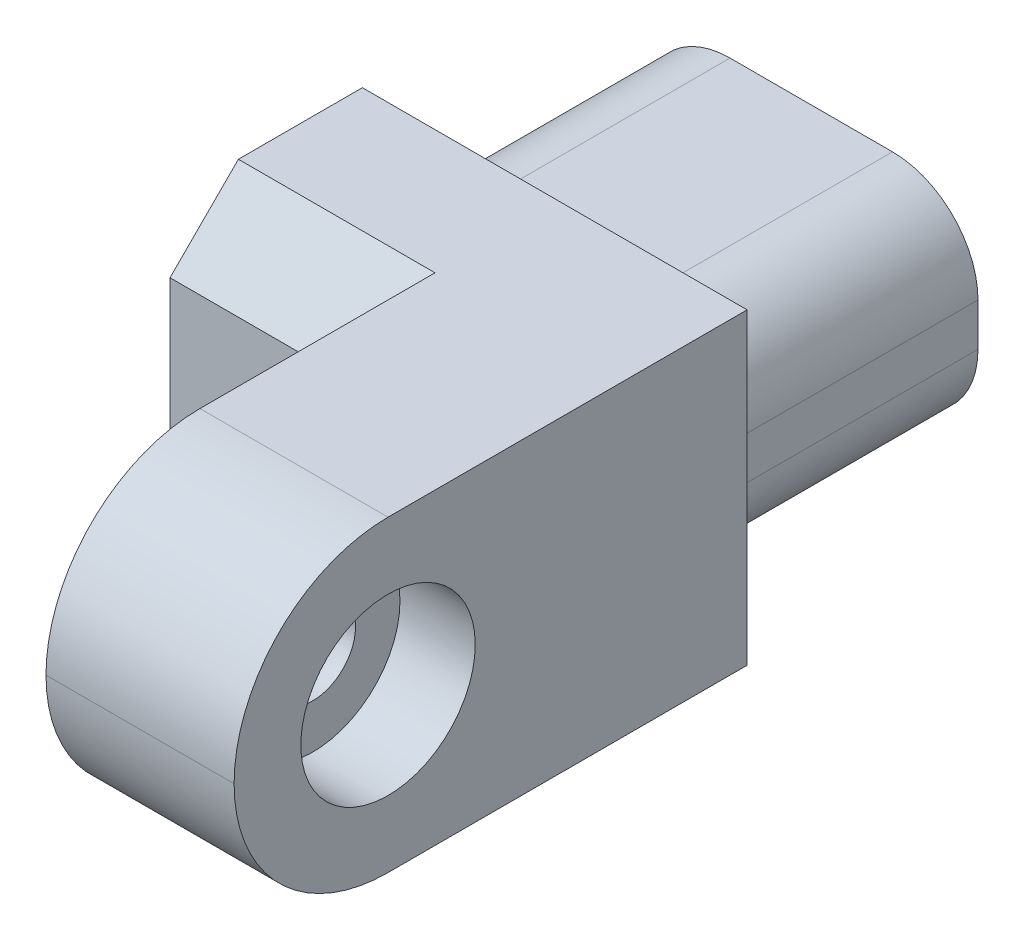
ISO-10303-21;
HEADER;
FILE_DESCRIPTION(('STEP AP214'),'2;1');
FILE_NAME('part.step','',(''),(''),'','','');
FILE_SCHEMA(('AUTOMOTIVE_DESIGN { 1 0 10303 214 1 1 1 1 }'));
ENDSEC;
DATA;
#1=APPLICATION_CONTEXT('core data for automotive mechanical design processes');
#2=APPLICATION_PROTOCOL_DEFINITION('international standard','automotive_design',2000,#1);
#3=PRODUCT_CONTEXT('',#1,'mechanical');
#4=PRODUCT('Part','Part','',(#3));
#5=PRODUCT_RELATED_PRODUCT_CATEGORY('part','',(#4));
#6=PRODUCT_DEFINITION_FORMATION('','',#4);
#7=PRODUCT_DEFINITION_CONTEXT('part definition',#1,'design');
#8=PRODUCT_DEFINITION('design','',#6,#7);
#9=PRODUCT_DEFINITION_SHAPE('','',#8);
#10=(LENGTH_UNIT() NAMED_UNIT(*) SI_UNIT(.MILLI.,.METRE.));
#11=(NAMED_UNIT(*) PLANE_ANGLE_UNIT() SI_UNIT($,.RADIAN.));
#12=(NAMED_UNIT(*) SI_UNIT($,.STERADIAN.) SOLID_ANGLE_UNIT());
#13=UNCERTAINTY_MEASURE_WITH_UNIT(LENGTH_MEASURE(1.E-05),#10,'distance_accuracy_value','');
#14=(GEOMETRIC_REPRESENTATION_CONTEXT(3) GLOBAL_UNCERTAINTY_ASSIGNED_CONTEXT((#13)) GLOBAL_UNIT_ASSIGNED_CONTEXT((#10,
#11,#12)) REPRESENTATION_CONTEXT('',''));
#15=CARTESIAN_POINT('',(0.,0.,0.));
#16=DIRECTION('',(0.,0.,1.));
#17=DIRECTION('',(1.,0.,0.));
#18=AXIS2_PLACEMENT_3D('',#15,#16,#17);
#19=CARTESIAN_POINT('',(-12.3825,-7.9375,-19.05));
#20=DIRECTION('',(-1.,0.,0.));
#21=DIRECTION('',(0.,0.,1.));
#22=AXIS2_PLACEMENT_3D('',#19,#20,#21);
#23=PLANE('',#22);
#24=DIRECTION('',(0.,-1.,0.));
#25=VECTOR('',#24,1.);
#26=CARTESIAN_POINT('',(-12.3825,-7.9375,-19.05));
#27=LINE('',#26,#25);
#28=CARTESIAN_POINT('',(-12.3825,1.5875,-19.05));
#29=VERTEX_POINT('',#28);
#30=CARTESIAN_POINT('',(-12.3825,-1.5875,-19.05));
#31=VERTEX_POINT('',#30);
#32=EDGE_CURVE('E213',#29,#31,#27,.T.);
#33=ORIENTED_EDGE('',*,*,#32,.T.);
#34=DIRECTION('',(0.,0.,1.));
#35=VECTOR('',#34,1.);
#36=CARTESIAN_POINT('',(-12.3825,-1.5875,-19.05));
#37=LINE('',#36,#35);
#38=CARTESIAN_POINT('',(-12.3825,-1.5875,0.));
#39=VERTEX_POINT('',#38);
#40=EDGE_CURVE('E272',#31,#39,#37,.T.);
#41=ORIENTED_EDGE('',*,*,#40,.T.);
#42=DIRECTION('',(0.,-1.,0.));
#43=VECTOR('',#42,1.);
#44=CARTESIAN_POINT('',(-12.3825,-7.9375,0.));
#45=LINE('',#44,#43);
#46=CARTESIAN_POINT('',(-12.3825,1.5875,0.));
#47=VERTEX_POINT('',#46);
#48=EDGE_CURVE('E176',#47,#39,#45,.T.);
#49=ORIENTED_EDGE('',*,*,#48,.F.);
#50=DIRECTION('',(0.,0.,1.));
#51=VECTOR('',#50,1.);
#52=CARTESIAN_POINT('',(-12.3825,1.5875,-19.05));
#53=LINE('',#52,#51);
#54=EDGE_CURVE('E263',#47,#29,#53,.F.);
#55=ORIENTED_EDGE('',*,*,#54,.T.);
#56=EDGE_LOOP('',(#33,#41,#49,#55));
#57=FACE_BOUND('',#56,.T.);
#58=ADVANCED_FACE('F43',(#57),#23,.T.);
#59=CARTESIAN_POINT('',(12.3825,7.9375,-19.05));
#60=DIRECTION('',(0.,1.,0.));
#61=DIRECTION('',(-1.,0.,0.));
#62=AXIS2_PLACEMENT_3D('',#59,#60,#61);
#63=PLANE('',#62);
#64=DIRECTION('',(-1.,0.,0.));
#65=VECTOR('',#64,1.);
#66=CARTESIAN_POINT('',(12.3825,7.9375,-19.05));
#67=LINE('',#66,#65);
#68=CARTESIAN_POINT('',(6.03250000000001,7.9375,-19.05));
#69=VERTEX_POINT('',#68);
#70=CARTESIAN_POINT('',(-6.03249999999999,7.9375,-19.05));
#71=VERTEX_POINT('',#70);
#72=EDGE_CURVE('E226',#69,#71,#67,.T.);
#73=ORIENTED_EDGE('',*,*,#72,.T.);
#74=DIRECTION('',(0.,0.,1.));
#75=VECTOR('',#74,1.);
#76=CARTESIAN_POINT('',(-6.03249999999999,7.9375,-19.05));
#77=LINE('',#76,#75);
#78=CARTESIAN_POINT('',(-6.03249999999999,7.9375,0.));
#79=VERTEX_POINT('',#78);
#80=EDGE_CURVE('E298',#71,#79,#77,.T.);
#81=ORIENTED_EDGE('',*,*,#80,.T.);
#82=DIRECTION('',(-1.,0.,0.));
#83=VECTOR('',#82,1.);
#84=CARTESIAN_POINT('',(12.3825,7.9375,0.));
#85=LINE('',#84,#83);
#86=CARTESIAN_POINT('',(6.03250000000001,7.9375,0.));
#87=VERTEX_POINT('',#86);
#88=EDGE_CURVE('E218',#87,#79,#85,.T.);
#89=ORIENTED_EDGE('',*,*,#88,.F.);
#90=DIRECTION('',(0.,0.,1.));
#91=VECTOR('',#90,1.);
#92=CARTESIAN_POINT('',(6.03250000000001,7.9375,-19.05));
#93=LINE('',#92,#91);
#94=EDGE_CURVE('E295',#87,#69,#93,.F.);
#95=ORIENTED_EDGE('',*,*,#94,.T.);
#96=EDGE_LOOP('',(#73,#81,#89,#95));
#97=FACE_BOUND('',#96,.T.);
#98=ADVANCED_FACE('F404',(#97),#63,.T.);
#99=CARTESIAN_POINT('',(12.3825,-7.9375,-19.05));
#100=DIRECTION('',(1.,0.,0.));
#101=DIRECTION('',(0.,0.,-1.));
#102=AXIS2_PLACEMENT_3D('',#99,#100,#101);
#103=PLANE('',#102);
#104=DIRECTION('',(0.,1.,0.));
#105=VECTOR('',#104,1.);
#106=CARTESIAN_POINT('',(12.3825,-7.9375,0.));
#107=LINE('',#106,#105);
#108=CARTESIAN_POINT('',(12.3825,-1.5875,0.));
#109=VERTEX_POINT('',#108);
#110=CARTESIAN_POINT('',(12.3825,1.5875,0.));
#111=VERTEX_POINT('',#110);
#112=EDGE_CURVE('E238',#109,#111,#107,.T.);
#113=ORIENTED_EDGE('',*,*,#112,.F.);
#114=DIRECTION('',(0.,0.,1.));
#115=VECTOR('',#114,1.);
#116=CARTESIAN_POINT('',(12.3825,-1.5875,-19.05));
#117=LINE('',#116,#115);
#118=CARTESIAN_POINT('',(12.3825,-1.5875,-19.05));
#119=VERTEX_POINT('',#118);
#120=EDGE_CURVE('E306',#109,#119,#117,.F.);
#121=ORIENTED_EDGE('',*,*,#120,.T.);
#122=DIRECTION('',(0.,1.,0.));
#123=VECTOR('',#122,1.);
#124=CARTESIAN_POINT('',(12.3825,-7.9375,-19.05));
#125=LINE('',#124,#123);
#126=CARTESIAN_POINT('',(12.3825,1.5875,-19.05));
#127=VERTEX_POINT('',#126);
#128=EDGE_CURVE('E222',#119,#127,#125,.T.);
#129=ORIENTED_EDGE('',*,*,#128,.T.);
#130=DIRECTION('',(0.,0.,1.));
#131=VECTOR('',#130,1.);
#132=CARTESIAN_POINT('',(12.3825,1.5875,-19.05));
#133=LINE('',#132,#131);
#134=EDGE_CURVE('E302',#127,#111,#133,.T.);
#135=ORIENTED_EDGE('',*,*,#134,.T.);
#136=EDGE_LOOP('',(#113,#121,#129,#135));
#137=FACE_BOUND('',#136,.T.);
#138=ADVANCED_FACE('F410',(#137),#103,.T.);
#139=CARTESIAN_POINT('',(12.3825,-7.9375,-19.05));
#140=DIRECTION('',(0.,-1.,0.));
#141=DIRECTION('',(1.,0.,0.));
#142=AXIS2_PLACEMENT_3D('',#139,#140,#141);
#143=PLANE('',#142);
#144=DIRECTION('',(1.,0.,0.));
#145=VECTOR('',#144,1.);
#146=CARTESIAN_POINT('',(12.3825,-7.9375,0.));
#147=LINE('',#146,#145);
#148=CARTESIAN_POINT('',(-6.0325,-7.9375,0.));
#149=VERTEX_POINT('',#148);
#150=CARTESIAN_POINT('',(6.03250000000001,-7.9375,0.));
#151=VERTEX_POINT('',#150);
#152=EDGE_CURVE('E234',#149,#151,#147,.T.);
#153=ORIENTED_EDGE('',*,*,#152,.F.);
#154=DIRECTION('',(0.,0.,1.));
#155=VECTOR('',#154,1.);
#156=CARTESIAN_POINT('',(-6.0325,-7.9375,-19.05));
#157=LINE('',#156,#155);
#158=CARTESIAN_POINT('',(-6.0325,-7.9375,-19.05));
#159=VERTEX_POINT('',#158);
#160=EDGE_CURVE('E280',#149,#159,#157,.F.);
#161=ORIENTED_EDGE('',*,*,#160,.T.);
#162=DIRECTION('',(1.,0.,0.));
#163=VECTOR('',#162,1.);
#164=CARTESIAN_POINT('',(12.3825,-7.9375,-19.05));
#165=LINE('',#164,#163);
#166=CARTESIAN_POINT('',(6.03250000000001,-7.9375,-19.05));
#167=VERTEX_POINT('',#166);
#168=EDGE_CURVE('E217',#159,#167,#165,.T.);
#169=ORIENTED_EDGE('',*,*,#168,.T.);
#170=DIRECTION('',(0.,0.,1.));
#171=VECTOR('',#170,1.);
#172=CARTESIAN_POINT('',(6.03250000000001,-7.9375,-19.05));
#173=LINE('',#172,#171);
#174=EDGE_CURVE('E276',#167,#151,#173,.T.);
#175=ORIENTED_EDGE('',*,*,#174,.T.);
#176=EDGE_LOOP('',(#153,#161,#169,#175));
#177=FACE_BOUND('',#176,.T.);
#178=ADVANCED_FACE('F415',(#177),#143,.T.);
#179=CARTESIAN_POINT('',(0.,0.,-19.05));
#180=DIRECTION('',(0.,0.,1.));
#181=DIRECTION('',(1.,0.,0.));
#182=AXIS2_PLACEMENT_3D('',#179,#180,#181);
#183=PLANE('',#182);
#184=ORIENTED_EDGE('',*,*,#168,.F.);
#185=CARTESIAN_POINT('',(-6.0325,-1.5875,-19.05));
#186=DIRECTION('',(0.,0.,1.));
#187=DIRECTION('',(1.,0.,0.));
#188=AXIS2_PLACEMENT_3D('',#185,#186,#187);
#189=CIRCLE('',#188,6.35);
#190=EDGE_CURVE('E292',#159,#31,#189,.F.);
#191=ORIENTED_EDGE('',*,*,#190,.T.);
#192=ORIENTED_EDGE('',*,*,#32,.F.);
#193=CARTESIAN_POINT('',(-6.03249999999999,1.5875,-19.05));
#194=DIRECTION('',(0.,0.,1.));
#195=DIRECTION('',(1.,0.,0.));
#196=AXIS2_PLACEMENT_3D('',#193,#194,#195);
#197=CIRCLE('',#196,6.35);
#198=EDGE_CURVE('E289',#29,#71,#197,.F.);
#199=ORIENTED_EDGE('',*,*,#198,.T.);
#200=ORIENTED_EDGE('',*,*,#72,.F.);
#201=CARTESIAN_POINT('',(6.03250000000001,1.5875,-19.05));
#202=DIRECTION('',(0.,0.,1.));
#203=DIRECTION('',(1.,0.,0.));
#204=AXIS2_PLACEMENT_3D('',#201,#202,#203);
#205=CIRCLE('',#204,6.35);
#206=EDGE_CURVE('E283',#69,#127,#205,.F.);
#207=ORIENTED_EDGE('',*,*,#206,.T.);
#208=ORIENTED_EDGE('',*,*,#128,.F.);
#209=CARTESIAN_POINT('',(6.03250000000001,-1.5875,-19.05));
#210=DIRECTION('',(0.,0.,1.));
#211=DIRECTION('',(1.,0.,0.));
#212=AXIS2_PLACEMENT_3D('',#209,#210,#211);
#213=CIRCLE('',#212,6.35);
#214=EDGE_CURVE('E286',#119,#167,#213,.F.);
#215=ORIENTED_EDGE('',*,*,#214,.T.);
#216=EDGE_LOOP('',(#184,#191,#192,#199,#200,#207,#208,#215));
#217=FACE_BOUND('',#216,.T.);
#218=ADVANCED_FACE('F472',(#217),#183,.F.);
#219=CARTESIAN_POINT('',(0.,0.,0.));
#220=DIRECTION('',(0.,0.,1.));
#221=DIRECTION('',(1.,0.,0.));
#222=AXIS2_PLACEMENT_3D('',#219,#220,#221);
#223=PLANE('',#222);
#224=DIRECTION('',(0.,-1.,0.));
#225=VECTOR('',#224,1.);
#226=CARTESIAN_POINT('',(-14.2875,-11.43,0.));
#227=LINE('',#226,#225);
#228=CARTESIAN_POINT('',(-14.2875,11.43,0.));
#229=VERTEX_POINT('',#228);
#230=CARTESIAN_POINT('',(-14.2875,-11.43,0.));
#231=VERTEX_POINT('',#230);
#232=EDGE_CURVE('E184',#229,#231,#227,.T.);
#233=ORIENTED_EDGE('',*,*,#232,.F.);
#234=DIRECTION('',(-1.,0.,0.));
#235=VECTOR('',#234,1.);
#236=CARTESIAN_POINT('',(14.2875,11.43,0.));
#237=LINE('',#236,#235);
#238=CARTESIAN_POINT('',(14.2875,11.43,0.));
#239=VERTEX_POINT('',#238);
#240=EDGE_CURVE('E203',#239,#229,#237,.T.);
#241=ORIENTED_EDGE('',*,*,#240,.F.);
#242=DIRECTION('',(0.,1.,0.));
#243=VECTOR('',#242,1.);
#244=CARTESIAN_POINT('',(14.2875,-11.43,0.));
#245=LINE('',#244,#243);
#246=CARTESIAN_POINT('',(14.2875,-11.43,0.));
#247=VERTEX_POINT('',#246);
#248=EDGE_CURVE('E186',#247,#239,#245,.T.);
#249=ORIENTED_EDGE('',*,*,#248,.F.);
#250=DIRECTION('',(1.,0.,0.));
#251=VECTOR('',#250,1.);
#252=CARTESIAN_POINT('',(14.2875,-11.43,0.));
#253=LINE('',#252,#251);
#254=EDGE_CURVE('E169',#231,#247,#253,.T.);
#255=ORIENTED_EDGE('',*,*,#254,.F.);
#256=EDGE_LOOP('',(#233,#241,#249,#255));
#257=FACE_BOUND('',#256,.T.);
#258=ORIENTED_EDGE('',*,*,#112,.T.);
#259=CARTESIAN_POINT('',(6.03250000000001,1.5875,0.));
#260=DIRECTION('',(0.,0.,1.));
#261=DIRECTION('',(1.,0.,0.));
#262=AXIS2_PLACEMENT_3D('',#259,#260,#261);
#263=CIRCLE('',#262,6.35);
#264=EDGE_CURVE('E318',#111,#87,#263,.T.);
#265=ORIENTED_EDGE('',*,*,#264,.T.);
#266=ORIENTED_EDGE('',*,*,#88,.T.);
#267=CARTESIAN_POINT('',(-6.03249999999999,1.5875,0.));
#268=DIRECTION('',(0.,0.,1.));
#269=DIRECTION('',(1.,0.,0.));
#270=AXIS2_PLACEMENT_3D('',#267,#268,#269);
#271=CIRCLE('',#270,6.35);
#272=EDGE_CURVE('E312',#79,#47,#271,.T.);
#273=ORIENTED_EDGE('',*,*,#272,.T.);
#274=ORIENTED_EDGE('',*,*,#48,.T.);
#275=CARTESIAN_POINT('',(-6.0325,-1.5875,0.));
#276=DIRECTION('',(0.,0.,1.));
#277=DIRECTION('',(1.,0.,0.));
#278=AXIS2_PLACEMENT_3D('',#275,#276,#277);
#279=CIRCLE('',#278,6.35);
#280=EDGE_CURVE('E309',#39,#149,#279,.T.);
#281=ORIENTED_EDGE('',*,*,#280,.T.);
#282=ORIENTED_EDGE('',*,*,#152,.T.);
#283=CARTESIAN_POINT('',(6.03250000000001,-1.5875,0.));
#284=DIRECTION('',(0.,0.,1.));
#285=DIRECTION('',(1.,0.,0.));
#286=AXIS2_PLACEMENT_3D('',#283,#284,#285);
#287=CIRCLE('',#286,6.35);
#288=EDGE_CURVE('E315',#151,#109,#287,.T.);
#289=ORIENTED_EDGE('',*,*,#288,.T.);
#290=EDGE_LOOP('',(#258,#265,#266,#273,#274,#281,#282,#289));
#291=FACE_BOUND('',#290,.T.);
#292=ADVANCED_FACE('F181',(#257,#291),#223,.F.);
#293=CARTESIAN_POINT('',(-14.2875,-11.43,38.1));
#294=DIRECTION('',(1.,0.,0.));
#295=DIRECTION('',(0.,0.,-1.));
#296=AXIS2_PLACEMENT_3D('',#293,#294,#295);
#297=PLANE('',#296);
#298=DIRECTION('',(0.,0.,-1.));
#299=VECTOR('',#298,1.);
#300=CARTESIAN_POINT('',(-14.2875,-11.43,38.1));
#301=LINE('',#300,#299);
#302=CARTESIAN_POINT('',(-14.2875,-11.43,9.20749999999999));
#303=VERTEX_POINT('',#302);
#304=EDGE_CURVE('E165',#303,#231,#301,.T.);
#305=ORIENTED_EDGE('',*,*,#304,.F.);
#306=DIRECTION('',(0.,-0.707106781186546,-0.707106781186549));
#307=VECTOR('',#306,1.);
#308=CARTESIAN_POINT('',(-14.2875,-6.34999999999999,14.2875));
#309=LINE('',#308,#307);
#310=CARTESIAN_POINT('',(-14.2875,-6.34999999999999,14.2875));
#311=VERTEX_POINT('',#310);
#312=EDGE_CURVE('E332',#303,#311,#309,.F.);
#313=ORIENTED_EDGE('',*,*,#312,.T.);
#314=DIRECTION('',(0.,-1.,0.));
#315=VECTOR('',#314,1.);
#316=CARTESIAN_POINT('',(-14.2875,11.43,14.2875));
#317=LINE('',#316,#315);
#318=CARTESIAN_POINT('',(-14.2875,6.34999999999998,14.2875));
#319=VERTEX_POINT('',#318);
#320=EDGE_CURVE('E197',#319,#311,#317,.T.);
#321=ORIENTED_EDGE('',*,*,#320,.F.);
#322=DIRECTION('',(0.,-0.707106781186549,0.707106781186546));
#323=VECTOR('',#322,1.);
#324=CARTESIAN_POINT('',(-14.2875,11.43,9.20750000000001));
#325=LINE('',#324,#323);
#326=CARTESIAN_POINT('',(-14.2875,11.43,9.20750000000001));
#327=VERTEX_POINT('',#326);
#328=EDGE_CURVE('E68',#319,#327,#325,.F.);
#329=ORIENTED_EDGE('',*,*,#328,.T.);
#330=DIRECTION('',(0.,0.,-1.));
#331=VECTOR('',#330,1.);
#332=CARTESIAN_POINT('',(-14.2875,11.43,38.1));
#333=LINE('',#332,#331);
#334=EDGE_CURVE('E190',#327,#229,#333,.T.);
#335=ORIENTED_EDGE('',*,*,#334,.T.);
#336=ORIENTED_EDGE('',*,*,#232,.T.);
#337=EDGE_LOOP('',(#305,#313,#321,#329,#335,#336));
#338=FACE_BOUND('',#337,.T.);
#339=ADVANCED_FACE('F189',(#338),#297,.F.);
#340=CARTESIAN_POINT('',(14.2875,-11.43,38.1));
#341=DIRECTION('',(0.,1.,0.));
#342=DIRECTION('',(-1.,0.,0.));
#343=AXIS2_PLACEMENT_3D('',#340,#341,#342);
#344=PLANE('',#343);
#345=DIRECTION('',(0.,0.,1.));
#346=VECTOR('',#345,1.);
#347=CARTESIAN_POINT('',(0.317499999999998,-11.43,38.1));
#348=LINE('',#347,#346);
#349=CARTESIAN_POINT('',(0.317499999999998,-11.43,9.20749999999998));
#350=VERTEX_POINT('',#349);
#351=CARTESIAN_POINT('',(0.317499999999998,-11.43,26.67));
#352=VERTEX_POINT('',#351);
#353=EDGE_CURVE('E268',#350,#352,#348,.T.);
#354=ORIENTED_EDGE('',*,*,#353,.F.);
#355=DIRECTION('',(-1.,0.,0.));
#356=VECTOR('',#355,1.);
#357=CARTESIAN_POINT('',(14.2875,-11.43,9.20749999999998));
#358=LINE('',#357,#356);
#359=EDGE_CURVE('E172',#350,#303,#358,.T.);
#360=ORIENTED_EDGE('',*,*,#359,.T.);
#361=ORIENTED_EDGE('',*,*,#304,.T.);
#362=ORIENTED_EDGE('',*,*,#254,.T.);
#363=DIRECTION('',(0.,0.,-1.));
#364=VECTOR('',#363,1.);
#365=CARTESIAN_POINT('',(14.2875,-11.43,38.1));
#366=LINE('',#365,#364);
#367=CARTESIAN_POINT('',(14.2875,-11.43,26.67));
#368=VERTEX_POINT('',#367);
#369=EDGE_CURVE('E177',#368,#247,#366,.T.);
#370=ORIENTED_EDGE('',*,*,#369,.F.);
#371=DIRECTION('',(1.,0.,0.));
#372=VECTOR('',#371,1.);
#373=CARTESIAN_POINT('',(0.317499999999998,-11.43,26.67));
#374=LINE('',#373,#372);
#375=EDGE_CURVE('E260',#368,#352,#374,.F.);
#376=ORIENTED_EDGE('',*,*,#375,.T.);
#377=EDGE_LOOP('',(#354,#360,#361,#362,#370,#376));
#378=FACE_BOUND('',#377,.T.);
#379=ADVANCED_FACE('F167',(#378),#344,.F.);
#380=CARTESIAN_POINT('',(14.2875,-11.43,38.1));
#381=DIRECTION('',(-1.,0.,0.));
#382=DIRECTION('',(0.,0.,1.));
#383=AXIS2_PLACEMENT_3D('',#380,#381,#382);
#384=PLANE('',#383);
#385=CARTESIAN_POINT('',(14.2875,0.,26.67));
#386=DIRECTION('',(1.,0.,0.));
#387=DIRECTION('',(0.,0.,-1.));
#388=AXIS2_PLACEMENT_3D('',#385,#386,#387);
#389=CIRCLE('',#388,6.477);
#390=CARTESIAN_POINT('',(14.2875,0.,20.193));
#391=VERTEX_POINT('',#390);
#392=EDGE_CURVE('E367',#391,#391,#389,.T.);
#393=ORIENTED_EDGE('',*,*,#392,.F.);
#394=EDGE_LOOP('',(#393));
#395=FACE_BOUND('',#394,.T.);
#396=DIRECTION('',(0.,0.,-1.));
#397=VECTOR('',#396,1.);
#398=CARTESIAN_POINT('',(14.2875,11.43,38.1));
#399=LINE('',#398,#397);
#400=CARTESIAN_POINT('',(14.2875,11.43,26.67));
#401=VERTEX_POINT('',#400);
#402=EDGE_CURVE('E208',#401,#239,#399,.T.);
#403=ORIENTED_EDGE('',*,*,#402,.F.);
#404=CARTESIAN_POINT('',(14.2875,0.,26.67));
#405=DIRECTION('',(-1.,0.,0.));
#406=DIRECTION('',(0.,0.,1.));
#407=AXIS2_PLACEMENT_3D('',#404,#405,#406);
#408=CIRCLE('',#407,11.43);
#409=CARTESIAN_POINT('',(14.2875,0.,38.1));
#410=VERTEX_POINT('',#409);
#411=EDGE_CURVE('E257',#401,#410,#408,.F.);
#412=ORIENTED_EDGE('',*,*,#411,.T.);
#413=CARTESIAN_POINT('',(14.2875,0.,26.67));
#414=DIRECTION('',(-1.,0.,0.));
#415=DIRECTION('',(0.,0.,1.));
#416=AXIS2_PLACEMENT_3D('',#413,#414,#415);
#417=CIRCLE('',#416,11.43);
#418=EDGE_CURVE('E254',#410,#368,#417,.F.);
#419=ORIENTED_EDGE('',*,*,#418,.T.);
#420=ORIENTED_EDGE('',*,*,#369,.T.);
#421=ORIENTED_EDGE('',*,*,#248,.T.);
#422=EDGE_LOOP('',(#403,#412,#419,#420,#421));
#423=FACE_BOUND('',#422,.T.);
#424=ADVANCED_FACE('F400',(#395,#423),#384,.F.);
#425=CARTESIAN_POINT('',(14.2875,11.43,38.1));
#426=DIRECTION('',(0.,-1.,0.));
#427=DIRECTION('',(1.,0.,0.));
#428=AXIS2_PLACEMENT_3D('',#425,#426,#427);
#429=PLANE('',#428);
#430=ORIENTED_EDGE('',*,*,#334,.F.);
#431=DIRECTION('',(1.,0.,0.));
#432=VECTOR('',#431,1.);
#433=CARTESIAN_POINT('',(14.2875,11.43,9.20750000000001));
#434=LINE('',#433,#432);
#435=CARTESIAN_POINT('',(0.317499999999994,11.43,9.20750000000001));
#436=VERTEX_POINT('',#435);
#437=EDGE_CURVE('E335',#327,#436,#434,.T.);
#438=ORIENTED_EDGE('',*,*,#437,.T.);
#439=DIRECTION('',(0.,0.,1.));
#440=VECTOR('',#439,1.);
#441=CARTESIAN_POINT('',(0.317499999999994,11.43,38.1));
#442=LINE('',#441,#440);
#443=CARTESIAN_POINT('',(0.317499999999994,11.43,26.67));
#444=VERTEX_POINT('',#443);
#445=EDGE_CURVE('E60',#436,#444,#442,.T.);
#446=ORIENTED_EDGE('',*,*,#445,.T.);
#447=DIRECTION('',(-1.,0.,0.));
#448=VECTOR('',#447,1.);
#449=CARTESIAN_POINT('',(14.2875,11.43,26.67));
#450=LINE('',#449,#448);
#451=EDGE_CURVE('E250',#444,#401,#450,.F.);
#452=ORIENTED_EDGE('',*,*,#451,.T.);
#453=ORIENTED_EDGE('',*,*,#402,.T.);
#454=ORIENTED_EDGE('',*,*,#240,.T.);
#455=EDGE_LOOP('',(#430,#438,#446,#452,#453,#454));
#456=FACE_BOUND('',#455,.T.);
#457=ADVANCED_FACE('F392',(#456),#429,.F.);
#458=CARTESIAN_POINT('',(0.317499999999994,11.43,38.1));
#459=DIRECTION('',(1.,0.,0.));
#460=DIRECTION('',(0.,1.,0.));
#461=AXIS2_PLACEMENT_3D('',#458,#459,#460);
#462=PLANE('',#461);
#463=CARTESIAN_POINT('',(0.317499999999996,0.,26.67));
#464=DIRECTION('',(1.,0.,0.));
#465=DIRECTION('',(0.,1.,0.));
#466=AXIS2_PLACEMENT_3D('',#463,#464,#465);
#467=CIRCLE('',#466,6.477);
#468=CARTESIAN_POINT('',(0.317499999999995,6.477,26.67));
#469=VERTEX_POINT('',#468);
#470=EDGE_CURVE('E48',#469,#469,#467,.T.);
#471=ORIENTED_EDGE('',*,*,#470,.T.);
#472=EDGE_LOOP('',(#471));
#473=FACE_BOUND('',#472,.T.);
#474=CARTESIAN_POINT('',(0.317499999999996,0.,26.67));
#475=DIRECTION('',(1.,0.,0.));
#476=DIRECTION('',(0.,1.,0.));
#477=AXIS2_PLACEMENT_3D('',#474,#475,#476);
#478=CIRCLE('',#477,11.43);
#479=CARTESIAN_POINT('',(0.317499999999996,0.,38.1));
#480=VERTEX_POINT('',#479);
#481=EDGE_CURVE('E230',#352,#480,#478,.F.);
#482=ORIENTED_EDGE('',*,*,#481,.T.);
#483=CARTESIAN_POINT('',(0.317499999999996,0.,26.67));
#484=DIRECTION('',(1.,0.,0.));
#485=DIRECTION('',(0.,1.,0.));
#486=AXIS2_PLACEMENT_3D('',#483,#484,#485);
#487=CIRCLE('',#486,11.43);
#488=EDGE_CURVE('E247',#480,#444,#487,.F.);
#489=ORIENTED_EDGE('',*,*,#488,.T.);
#490=ORIENTED_EDGE('',*,*,#445,.F.);
#491=DIRECTION('',(0.,0.707106781186549,-0.707106781186546));
#492=VECTOR('',#491,1.);
#493=CARTESIAN_POINT('',(0.317499999999996,-3.01624999999999,23.65375));
#494=LINE('',#493,#492);
#495=CARTESIAN_POINT('',(0.317499999999995,6.34999999999999,14.2875));
#496=VERTEX_POINT('',#495);
#497=EDGE_CURVE('E11',#436,#496,#494,.F.);
#498=ORIENTED_EDGE('',*,*,#497,.T.);
#499=DIRECTION('',(0.,-1.,0.));
#500=VECTOR('',#499,1.);
#501=CARTESIAN_POINT('',(0.317499999999994,11.43,14.2875));
#502=LINE('',#501,#500);
#503=CARTESIAN_POINT('',(0.317499999999997,-6.34999999999999,14.2875));
#504=VERTEX_POINT('',#503);
#505=EDGE_CURVE('E193',#496,#504,#502,.T.);
#506=ORIENTED_EDGE('',*,*,#505,.T.);
#507=DIRECTION('',(0.,0.707106781186546,0.707106781186549));
#508=VECTOR('',#507,1.);
#509=CARTESIAN_POINT('',(0.317499999999993,14.44625,35.08375));
#510=LINE('',#509,#508);
#511=EDGE_CURVE('E54',#504,#350,#510,.F.);
#512=ORIENTED_EDGE('',*,*,#511,.T.);
#513=ORIENTED_EDGE('',*,*,#353,.T.);
#514=EDGE_LOOP('',(#482,#489,#490,#498,#506,#512,#513));
#515=FACE_BOUND('',#514,.T.);
#516=ADVANCED_FACE('F342',(#473,#515),#462,.F.);
#517=CARTESIAN_POINT('',(-14.2875,11.43,14.2875));
#518=DIRECTION('',(0.,0.,-1.));
#519=DIRECTION('',(-1.,0.,0.));
#520=AXIS2_PLACEMENT_3D('',#517,#518,#519);
#521=PLANE('',#520);
#522=ORIENTED_EDGE('',*,*,#320,.T.);
#523=DIRECTION('',(1.,0.,0.));
#524=VECTOR('',#523,1.);
#525=CARTESIAN_POINT('',(-14.2875,-6.34999999999999,14.2875));
#526=LINE('',#525,#524);
#527=EDGE_CURVE('E324',#311,#504,#526,.T.);
#528=ORIENTED_EDGE('',*,*,#527,.T.);
#529=ORIENTED_EDGE('',*,*,#505,.F.);
#530=DIRECTION('',(-1.,0.,0.));
#531=VECTOR('',#530,1.);
#532=CARTESIAN_POINT('',(-14.2875,6.34999999999998,14.2875));
#533=LINE('',#532,#531);
#534=EDGE_CURVE('E321',#496,#319,#533,.T.);
#535=ORIENTED_EDGE('',*,*,#534,.T.);
#536=EDGE_LOOP('',(#522,#528,#529,#535));
#537=FACE_BOUND('',#536,.T.);
#538=ADVANCED_FACE('F350',(#537),#521,.F.);
#539=CARTESIAN_POINT('',(0.,0.,26.67));
#540=DIRECTION('',(-1.,0.,0.));
#541=DIRECTION('',(0.,-1.,0.));
#542=AXIS2_PLACEMENT_3D('',#539,#540,#541);
#543=CYLINDRICAL_SURFACE('',#542,11.43);
#544=ORIENTED_EDGE('',*,*,#375,.F.);
#545=ORIENTED_EDGE('',*,*,#418,.F.);
#546=DIRECTION('',(1.,0.,0.));
#547=VECTOR('',#546,1.);
#548=CARTESIAN_POINT('',(14.2875,0.,38.1));
#549=LINE('',#548,#547);
#550=EDGE_CURVE('E264',#480,#410,#549,.T.);
#551=ORIENTED_EDGE('',*,*,#550,.F.);
#552=ORIENTED_EDGE('',*,*,#481,.F.);
#553=EDGE_LOOP('',(#544,#545,#551,#552));
#554=FACE_BOUND('',#553,.T.);
#555=ADVANCED_FACE('F398',(#554),#543,.T.);
#556=CARTESIAN_POINT('',(0.,0.,26.67));
#557=DIRECTION('',(1.,0.,0.));
#558=DIRECTION('',(0.,1.,0.));
#559=AXIS2_PLACEMENT_3D('',#556,#557,#558);
#560=CYLINDRICAL_SURFACE('',#559,11.43);
#561=ORIENTED_EDGE('',*,*,#411,.F.);
#562=ORIENTED_EDGE('',*,*,#451,.F.);
#563=ORIENTED_EDGE('',*,*,#488,.F.);
#564=ORIENTED_EDGE('',*,*,#550,.T.);
#565=EDGE_LOOP('',(#561,#562,#563,#564));
#566=FACE_BOUND('',#565,.T.);
#567=ADVANCED_FACE('F417',(#566),#560,.T.);
#568=CARTESIAN_POINT('',(-6.0325,-1.5875,-19.05));
#569=DIRECTION('',(0.,0.,1.));
#570=DIRECTION('',(1.,0.,0.));
#571=AXIS2_PLACEMENT_3D('',#568,#569,#570);
#572=CYLINDRICAL_SURFACE('',#571,6.35);
#573=ORIENTED_EDGE('',*,*,#190,.F.);
#574=ORIENTED_EDGE('',*,*,#160,.F.);
#575=ORIENTED_EDGE('',*,*,#280,.F.);
#576=ORIENTED_EDGE('',*,*,#40,.F.);
#577=EDGE_LOOP('',(#573,#574,#575,#576));
#578=FACE_BOUND('',#577,.T.);
#579=ADVANCED_FACE('F420',(#578),#572,.T.);
#580=CARTESIAN_POINT('',(-6.03249999999999,1.5875,-19.05));
#581=DIRECTION('',(0.,0.,1.));
#582=DIRECTION('',(1.,0.,0.));
#583=AXIS2_PLACEMENT_3D('',#580,#581,#582);
#584=CYLINDRICAL_SURFACE('',#583,6.35);
#585=ORIENTED_EDGE('',*,*,#198,.F.);
#586=ORIENTED_EDGE('',*,*,#54,.F.);
#587=ORIENTED_EDGE('',*,*,#272,.F.);
#588=ORIENTED_EDGE('',*,*,#80,.F.);
#589=EDGE_LOOP('',(#585,#586,#587,#588));
#590=FACE_BOUND('',#589,.T.);
#591=ADVANCED_FACE('F427',(#590),#584,.T.);
#592=CARTESIAN_POINT('',(6.03250000000001,-1.5875,-19.05));
#593=DIRECTION('',(0.,0.,1.));
#594=DIRECTION('',(1.,0.,0.));
#595=AXIS2_PLACEMENT_3D('',#592,#593,#594);
#596=CYLINDRICAL_SURFACE('',#595,6.35);
#597=ORIENTED_EDGE('',*,*,#214,.F.);
#598=ORIENTED_EDGE('',*,*,#120,.F.);
#599=ORIENTED_EDGE('',*,*,#288,.F.);
#600=ORIENTED_EDGE('',*,*,#174,.F.);
#601=EDGE_LOOP('',(#597,#598,#599,#600));
#602=FACE_BOUND('',#601,.T.);
#603=ADVANCED_FACE('F431',(#602),#596,.T.);
#604=CARTESIAN_POINT('',(6.03250000000001,1.5875,-19.05));
#605=DIRECTION('',(0.,0.,1.));
#606=DIRECTION('',(1.,0.,0.));
#607=AXIS2_PLACEMENT_3D('',#604,#605,#606);
#608=CYLINDRICAL_SURFACE('',#607,6.35);
#609=ORIENTED_EDGE('',*,*,#206,.F.);
#610=ORIENTED_EDGE('',*,*,#94,.F.);
#611=ORIENTED_EDGE('',*,*,#264,.F.);
#612=ORIENTED_EDGE('',*,*,#134,.F.);
#613=EDGE_LOOP('',(#609,#610,#611,#612));
#614=FACE_BOUND('',#613,.T.);
#615=ADVANCED_FACE('F435',(#614),#608,.T.);
#616=CARTESIAN_POINT('',(-14.2875,-6.34999999999999,14.2875));
#617=DIRECTION('',(0.,0.707106781186549,-0.707106781186546));
#618=DIRECTION('',(1.,0.,0.));
#619=AXIS2_PLACEMENT_3D('',#616,#617,#618);
#620=PLANE('',#619);
#621=ORIENTED_EDGE('',*,*,#312,.F.);
#622=ORIENTED_EDGE('',*,*,#359,.F.);
#623=ORIENTED_EDGE('',*,*,#511,.F.);
#624=ORIENTED_EDGE('',*,*,#527,.F.);
#625=EDGE_LOOP('',(#621,#622,#623,#624));
#626=FACE_BOUND('',#625,.T.);
#627=ADVANCED_FACE('F347',(#626),#620,.F.);
#628=CARTESIAN_POINT('',(14.2875,11.43,9.20750000000001));
#629=DIRECTION('',(0.,-0.707106781186546,-0.707106781186549));
#630=DIRECTION('',(1.,0.,0.));
#631=AXIS2_PLACEMENT_3D('',#628,#629,#630);
#632=PLANE('',#631);
#633=ORIENTED_EDGE('',*,*,#328,.F.);
#634=ORIENTED_EDGE('',*,*,#534,.F.);
#635=ORIENTED_EDGE('',*,*,#497,.F.);
#636=ORIENTED_EDGE('',*,*,#437,.F.);
#637=EDGE_LOOP('',(#633,#634,#635,#636));
#638=FACE_BOUND('',#637,.T.);
#639=ADVANCED_FACE('F46',(#638),#632,.F.);
#640=CARTESIAN_POINT('',(14.2875,0.,26.67));
#641=DIRECTION('',(1.,0.,0.));
#642=DIRECTION('',(0.,0.,-1.));
#643=AXIS2_PLACEMENT_3D('',#640,#641,#642);
#644=CYLINDRICAL_SURFACE('',#643,3.175);
#645=CARTESIAN_POINT('',(5.2705,0.,26.67));
#646=DIRECTION('',(-1.,0.,0.));
#647=DIRECTION('',(0.,0.,1.));
#648=AXIS2_PLACEMENT_3D('',#645,#646,#647);
#649=CIRCLE('',#648,3.175);
#650=CARTESIAN_POINT('',(5.2705,0.,29.845));
#651=VERTEX_POINT('',#650);
#652=EDGE_CURVE('E371',#651,#651,#649,.T.);
#653=ORIENTED_EDGE('',*,*,#652,.T.);
#654=EDGE_LOOP('',(#653));
#655=FACE_BOUND('',#654,.T.);
#656=CARTESIAN_POINT('',(8.6995,0.,26.67));
#657=DIRECTION('',(1.,0.,0.));
#658=DIRECTION('',(0.,0.,-1.));
#659=AXIS2_PLACEMENT_3D('',#656,#657,#658);
#660=CIRCLE('',#659,3.175);
#661=CARTESIAN_POINT('',(8.6995,0.,23.495));
#662=VERTEX_POINT('',#661);
#663=EDGE_CURVE('E269',#662,#662,#660,.T.);
#664=ORIENTED_EDGE('',*,*,#663,.T.);
#665=EDGE_LOOP('',(#664));
#666=FACE_BOUND('',#665,.T.);
#667=ADVANCED_FACE('F446',(#655,#666),#644,.F.);
#668=CARTESIAN_POINT('',(8.6995,3.175,26.67));
#669=DIRECTION('',(-1.,0.,0.));
#670=DIRECTION('',(0.,0.,1.));
#671=AXIS2_PLACEMENT_3D('',#668,#669,#670);
#672=PLANE('',#671);
#673=ORIENTED_EDGE('',*,*,#663,.F.);
#674=EDGE_LOOP('',(#673));
#675=FACE_BOUND('',#674,.T.);
#676=CARTESIAN_POINT('',(8.6995,0.,26.67));
#677=DIRECTION('',(1.,0.,0.));
#678=DIRECTION('',(0.,0.,-1.));
#679=AXIS2_PLACEMENT_3D('',#676,#677,#678);
#680=CIRCLE('',#679,6.477);
#681=CARTESIAN_POINT('',(8.6995,0.,20.193));
#682=VERTEX_POINT('',#681);
#683=EDGE_CURVE('E363',#682,#682,#680,.T.);
#684=ORIENTED_EDGE('',*,*,#683,.T.);
#685=EDGE_LOOP('',(#684));
#686=FACE_BOUND('',#685,.T.);
#687=ADVANCED_FACE('F451',(#675,#686),#672,.F.);
#688=CARTESIAN_POINT('',(14.2875,0.,26.67));
#689=DIRECTION('',(1.,0.,0.));
#690=DIRECTION('',(0.,0.,-1.));
#691=AXIS2_PLACEMENT_3D('',#688,#689,#690);
#692=CYLINDRICAL_SURFACE('',#691,6.477);
#693=ORIENTED_EDGE('',*,*,#683,.F.);
#694=EDGE_LOOP('',(#693));
#695=FACE_BOUND('',#694,.T.);
#696=ORIENTED_EDGE('',*,*,#392,.T.);
#697=EDGE_LOOP('',(#696));
#698=FACE_BOUND('',#697,.T.);
#699=ADVANCED_FACE('F385',(#695,#698),#692,.F.);
#700=CARTESIAN_POINT('',(-0.317499999999998,0.,26.67));
#701=DIRECTION('',(-1.,0.,0.));
#702=DIRECTION('',(0.,0.,1.));
#703=AXIS2_PLACEMENT_3D('',#700,#701,#702);
#704=CYLINDRICAL_SURFACE('',#703,6.477);
#705=CARTESIAN_POINT('',(5.2705,0.,26.67));
#706=DIRECTION('',(-1.,0.,0.));
#707=DIRECTION('',(0.,0.,1.));
#708=AXIS2_PLACEMENT_3D('',#705,#706,#707);
#709=CIRCLE('',#708,6.477);
#710=CARTESIAN_POINT('',(5.2705,0.,33.147));
#711=VERTEX_POINT('',#710);
#712=EDGE_CURVE('E375',#711,#711,#709,.T.);
#713=ORIENTED_EDGE('',*,*,#712,.F.);
#714=EDGE_LOOP('',(#713));
#715=FACE_BOUND('',#714,.T.);
#716=ORIENTED_EDGE('',*,*,#470,.F.);
#717=EDGE_LOOP('',(#716));
#718=FACE_BOUND('',#717,.T.);
#719=ADVANCED_FACE('F382',(#715,#718),#704,.F.);
#720=CARTESIAN_POINT('',(5.2705,3.175,26.67));
#721=DIRECTION('',(1.,0.,0.));
#722=DIRECTION('',(0.,0.,-1.));
#723=AXIS2_PLACEMENT_3D('',#720,#721,#722);
#724=PLANE('',#723);
#725=ORIENTED_EDGE('',*,*,#652,.F.);
#726=EDGE_LOOP('',(#725));
#727=FACE_BOUND('',#726,.T.);
#728=ORIENTED_EDGE('',*,*,#712,.T.);
#729=EDGE_LOOP('',(#728));
#730=FACE_BOUND('',#729,.T.);
#731=ADVANCED_FACE('F380',(#727,#730),#724,.F.);
#732=CLOSED_SHELL('',(#58,#98,#138,#178,#218,#292,#339,#379,#424,#457,#516,#538,#555,#567,#579,
#591,#603,#615,#627,#639,#667,#687,#699,#719,#731));
#733=MANIFOLD_SOLID_BREP('B2',#732);
#734=ADVANCED_BREP_SHAPE_REPRESENTATION('',(#18,#733),#14);
#735=SHAPE_DEFINITION_REPRESENTATION(#9,#734);
ENDSEC;
END-ISO-10303-21;
